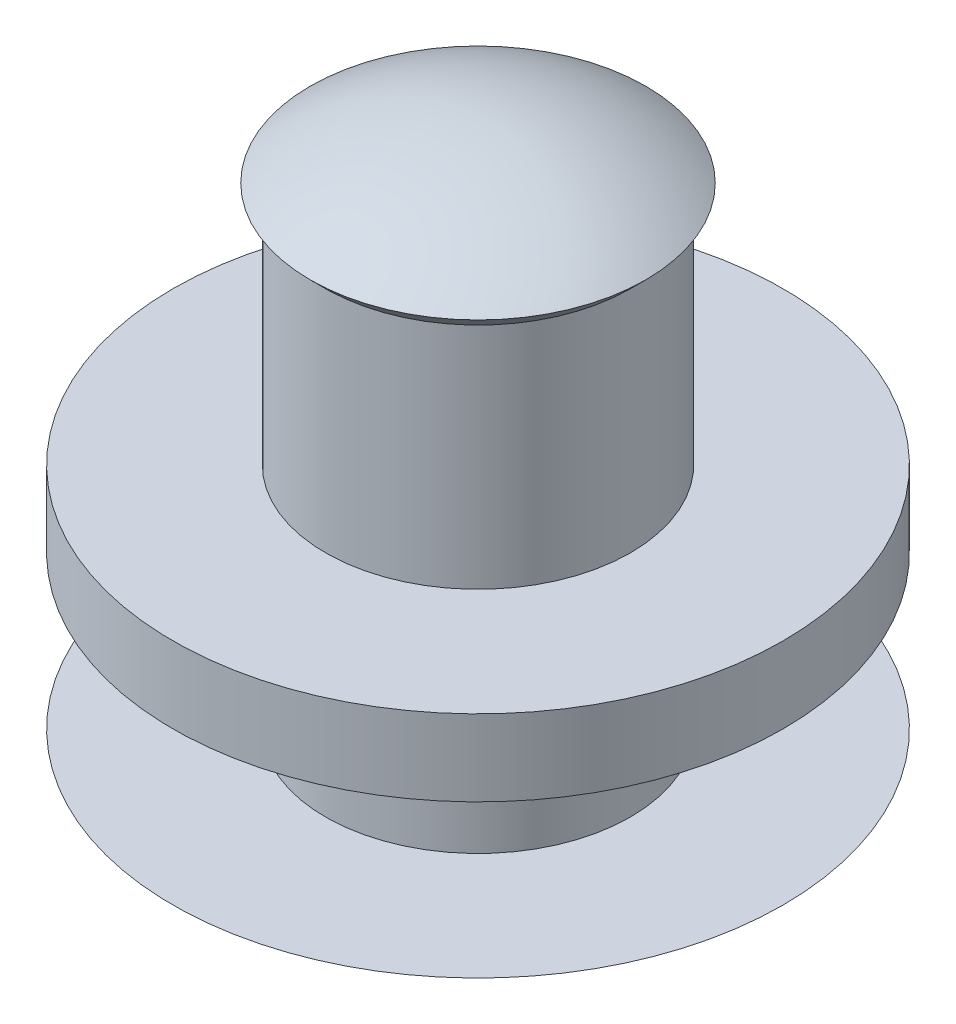
ISO-10303-21;
HEADER;
FILE_DESCRIPTION(('STEP AP214'),'2;1');
FILE_NAME('part.step','',(''),(''),'','','');
FILE_SCHEMA(('AUTOMOTIVE_DESIGN { 1 0 10303 214 1 1 1 1 }'));
ENDSEC;
DATA;
#1=APPLICATION_CONTEXT('core data for automotive mechanical design processes');
#2=APPLICATION_PROTOCOL_DEFINITION('international standard','automotive_design',2000,#1);
#3=PRODUCT_CONTEXT('',#1,'mechanical');
#4=PRODUCT('Part','Part','',(#3));
#5=PRODUCT_RELATED_PRODUCT_CATEGORY('part','',(#4));
#6=PRODUCT_DEFINITION_FORMATION('','',#4);
#7=PRODUCT_DEFINITION_CONTEXT('part definition',#1,'design');
#8=PRODUCT_DEFINITION('design','',#6,#7);
#9=PRODUCT_DEFINITION_SHAPE('','',#8);
#10=(LENGTH_UNIT() NAMED_UNIT(*) SI_UNIT(.MILLI.,.METRE.));
#11=(NAMED_UNIT(*) PLANE_ANGLE_UNIT() SI_UNIT($,.RADIAN.));
#12=(NAMED_UNIT(*) SI_UNIT($,.STERADIAN.) SOLID_ANGLE_UNIT());
#13=UNCERTAINTY_MEASURE_WITH_UNIT(LENGTH_MEASURE(1.E-05),#10,'distance_accuracy_value','');
#14=(GEOMETRIC_REPRESENTATION_CONTEXT(3) GLOBAL_UNCERTAINTY_ASSIGNED_CONTEXT((#13)) GLOBAL_UNIT_ASSIGNED_CONTEXT((#10,
#11,#12)) REPRESENTATION_CONTEXT('',''));
#15=CARTESIAN_POINT('',(0.,0.,0.));
#16=DIRECTION('',(0.,0.,1.));
#17=DIRECTION('',(1.,0.,0.));
#18=AXIS2_PLACEMENT_3D('',#15,#16,#17);
#19=CARTESIAN_POINT('',(0.,1.49999999999997,0.));
#20=DIRECTION('',(0.,-1.,0.));
#21=DIRECTION('',(1.00000000000004,0.,0.));
#22=AXIS2_PLACEMENT_3D('',#19,#20,#21);
#23=SPHERICAL_SURFACE('',#22,1.94164878389476);
#24=CARTESIAN_POINT('',(0.,3.09999999999997,0.));
#25=DIRECTION('',(0.,-1.,0.));
#26=DIRECTION('',(1.00000000000004,0.,0.));
#27=AXIS2_PLACEMENT_3D('',#24,#25,#26);
#28=CIRCLE('',#27,1.1);
#29=CARTESIAN_POINT('',(1.10000000000003,3.09999999999997,0.));
#30=VERTEX_POINT('',#29);
#31=EDGE_CURVE('E81',#30,#30,#28,.T.);
#32=ORIENTED_EDGE('',*,*,#31,.F.);
#33=EDGE_LOOP('',(#32));
#34=FACE_BOUND('',#33,.T.);
#35=ADVANCED_FACE('F44',(#34),#23,.T.);
#36=CARTESIAN_POINT('',(0.,6.51666666666641,0.));
#37=DIRECTION('',(0.,-1.,0.));
#38=DIRECTION('',(-1.00000000000004,0.,0.));
#39=AXIS2_PLACEMENT_3D('',#36,#37,#38);
#40=SPHERICAL_SURFACE('',#39,6.81666666666647);
#41=CARTESIAN_POINT('',(0.,0.,0.));
#42=DIRECTION('',(0.,-1.,0.));
#43=DIRECTION('',(1.00000000000004,0.,0.));
#44=AXIS2_PLACEMENT_3D('',#41,#42,#43);
#45=CIRCLE('',#44,2.);
#46=CARTESIAN_POINT('',(2.00000000000007,0.,0.));
#47=VERTEX_POINT('',#46);
#48=EDGE_CURVE('E12',#47,#47,#45,.T.);
#49=ORIENTED_EDGE('',*,*,#48,.T.);
#50=EDGE_LOOP('',(#49));
#51=FACE_BOUND('',#50,.T.);
#52=ADVANCED_FACE('F91',(#51),#40,.T.);
#53=CARTESIAN_POINT('',(1.99999999999999,0.,0.));
#54=DIRECTION('',(0.,1.,0.));
#55=DIRECTION('',(-1.00000000000004,0.,0.));
#56=AXIS2_PLACEMENT_3D('',#53,#54,#55);
#57=PLANE('',#56);
#58=CARTESIAN_POINT('',(0.,0.,0.));
#59=DIRECTION('',(0.,-1.,0.));
#60=DIRECTION('',(1.00000000000004,0.,0.));
#61=AXIS2_PLACEMENT_3D('',#58,#59,#60);
#62=CIRCLE('',#61,1.);
#63=CARTESIAN_POINT('',(1.00000000000004,0.,0.));
#64=VERTEX_POINT('',#63);
#65=EDGE_CURVE('E51',#64,#64,#62,.T.);
#66=ORIENTED_EDGE('',*,*,#65,.T.);
#67=EDGE_LOOP('',(#66));
#68=FACE_BOUND('',#67,.T.);
#69=ORIENTED_EDGE('',*,*,#48,.F.);
#70=EDGE_LOOP('',(#69));
#71=FACE_BOUND('',#70,.T.);
#72=ADVANCED_FACE('F95',(#68,#71),#57,.T.);
#73=CARTESIAN_POINT('',(0.,-0.300000000000057,0.));
#74=DIRECTION('',(0.,-1.,0.));
#75=DIRECTION('',(1.00000000000004,0.,0.));
#76=AXIS2_PLACEMENT_3D('',#73,#74,#75);
#77=CYLINDRICAL_SURFACE('',#76,1.);
#78=CARTESIAN_POINT('',(0.,1.,0.));
#79=DIRECTION('',(0.,-1.,0.));
#80=DIRECTION('',(1.00000000000004,0.,0.));
#81=AXIS2_PLACEMENT_3D('',#78,#79,#80);
#82=CIRCLE('',#81,1.);
#83=CARTESIAN_POINT('',(1.00000000000004,1.,0.));
#84=VERTEX_POINT('',#83);
#85=EDGE_CURVE('E57',#84,#84,#82,.T.);
#86=ORIENTED_EDGE('',*,*,#85,.T.);
#87=EDGE_LOOP('',(#86));
#88=FACE_BOUND('',#87,.T.);
#89=ORIENTED_EDGE('',*,*,#65,.F.);
#90=EDGE_LOOP('',(#89));
#91=FACE_BOUND('',#90,.T.);
#92=ADVANCED_FACE('F99',(#88,#91),#77,.T.);
#93=CARTESIAN_POINT('',(1.00000000000001,1.,0.));
#94=DIRECTION('',(0.,-1.,0.));
#95=DIRECTION('',(1.00000000000004,0.,0.));
#96=AXIS2_PLACEMENT_3D('',#93,#94,#95);
#97=PLANE('',#96);
#98=CARTESIAN_POINT('',(0.,1.,0.));
#99=DIRECTION('',(0.,-1.,0.));
#100=DIRECTION('',(1.00000000000004,0.,0.));
#101=AXIS2_PLACEMENT_3D('',#98,#99,#100);
#102=CIRCLE('',#101,2.);
#103=CARTESIAN_POINT('',(2.00000000000007,1.,0.));
#104=VERTEX_POINT('',#103);
#105=EDGE_CURVE('E63',#104,#104,#102,.T.);
#106=ORIENTED_EDGE('',*,*,#105,.T.);
#107=EDGE_LOOP('',(#106));
#108=FACE_BOUND('',#107,.T.);
#109=ORIENTED_EDGE('',*,*,#85,.F.);
#110=EDGE_LOOP('',(#109));
#111=FACE_BOUND('',#110,.T.);
#112=ADVANCED_FACE('F104',(#108,#111),#97,.T.);
#113=CARTESIAN_POINT('',(0.,-0.300000000000057,0.));
#114=DIRECTION('',(0.,-1.,0.));
#115=DIRECTION('',(1.00000000000004,0.,0.));
#116=AXIS2_PLACEMENT_3D('',#113,#114,#115);
#117=CYLINDRICAL_SURFACE('',#116,2.);
#118=CARTESIAN_POINT('',(0.,1.49999999999997,0.));
#119=DIRECTION('',(0.,-1.,0.));
#120=DIRECTION('',(1.00000000000004,0.,0.));
#121=AXIS2_PLACEMENT_3D('',#118,#119,#120);
#122=CIRCLE('',#121,2.);
#123=CARTESIAN_POINT('',(2.00000000000006,1.49999999999997,0.));
#124=VERTEX_POINT('',#123);
#125=EDGE_CURVE('E69',#124,#124,#122,.T.);
#126=ORIENTED_EDGE('',*,*,#125,.T.);
#127=EDGE_LOOP('',(#126));
#128=FACE_BOUND('',#127,.T.);
#129=ORIENTED_EDGE('',*,*,#105,.F.);
#130=EDGE_LOOP('',(#129));
#131=FACE_BOUND('',#130,.T.);
#132=ADVANCED_FACE('F108',(#128,#131),#117,.T.);
#133=CARTESIAN_POINT('',(2.00000000000001,1.50000000000001,0.));
#134=DIRECTION('',(0.,1.,0.));
#135=DIRECTION('',(-1.00000000000004,0.,0.));
#136=AXIS2_PLACEMENT_3D('',#133,#134,#135);
#137=PLANE('',#136);
#138=CARTESIAN_POINT('',(0.,1.49999999999997,0.));
#139=DIRECTION('',(0.,-1.,0.));
#140=DIRECTION('',(1.00000000000004,0.,0.));
#141=AXIS2_PLACEMENT_3D('',#138,#139,#140);
#142=CIRCLE('',#141,1.);
#143=CARTESIAN_POINT('',(1.00000000000003,1.49999999999997,0.));
#144=VERTEX_POINT('',#143);
#145=EDGE_CURVE('E73',#144,#144,#142,.T.);
#146=ORIENTED_EDGE('',*,*,#145,.T.);
#147=EDGE_LOOP('',(#146));
#148=FACE_BOUND('',#147,.T.);
#149=ORIENTED_EDGE('',*,*,#125,.F.);
#150=EDGE_LOOP('',(#149));
#151=FACE_BOUND('',#150,.T.);
#152=ADVANCED_FACE('F112',(#148,#151),#137,.T.);
#153=CARTESIAN_POINT('',(0.,-0.300000000000057,0.));
#154=DIRECTION('',(0.,-1.,0.));
#155=DIRECTION('',(1.00000000000004,0.,0.));
#156=AXIS2_PLACEMENT_3D('',#153,#154,#155);
#157=CYLINDRICAL_SURFACE('',#156,1.);
#158=CARTESIAN_POINT('',(0.,2.99999999999997,0.));
#159=DIRECTION('',(0.,-1.,0.));
#160=DIRECTION('',(1.00000000000004,0.,0.));
#161=AXIS2_PLACEMENT_3D('',#158,#159,#160);
#162=CIRCLE('',#161,1.);
#163=CARTESIAN_POINT('',(1.00000000000002,2.99999999999997,0.));
#164=VERTEX_POINT('',#163);
#165=EDGE_CURVE('E77',#164,#164,#162,.T.);
#166=ORIENTED_EDGE('',*,*,#165,.T.);
#167=EDGE_LOOP('',(#166));
#168=FACE_BOUND('',#167,.T.);
#169=ORIENTED_EDGE('',*,*,#145,.F.);
#170=EDGE_LOOP('',(#169));
#171=FACE_BOUND('',#170,.T.);
#172=ADVANCED_FACE('F116',(#168,#171),#157,.T.);
#173=CARTESIAN_POINT('',(0.,2.99999999999997,0.));
#174=DIRECTION('',(0.,1.,0.));
#175=DIRECTION('',(-1.00000000000004,0.,0.));
#176=AXIS2_PLACEMENT_3D('',#173,#174,#175);
#177=CONICAL_SURFACE('',#176,1.,0.785398163397447);
#178=ORIENTED_EDGE('',*,*,#31,.T.);
#179=EDGE_LOOP('',(#178));
#180=FACE_BOUND('',#179,.T.);
#181=ORIENTED_EDGE('',*,*,#165,.F.);
#182=EDGE_LOOP('',(#181));
#183=FACE_BOUND('',#182,.T.);
#184=ADVANCED_FACE('F87',(#180,#183),#177,.T.);
#185=CLOSED_SHELL('',(#35,#52,#72,#92,#112,#132,#152,#172,#184));
#186=MANIFOLD_SOLID_BREP('B2',#185);
#187=ADVANCED_BREP_SHAPE_REPRESENTATION('',(#18,#186),#14);
#188=SHAPE_DEFINITION_REPRESENTATION(#9,#187);
ENDSEC;
END-ISO-10303-21;
